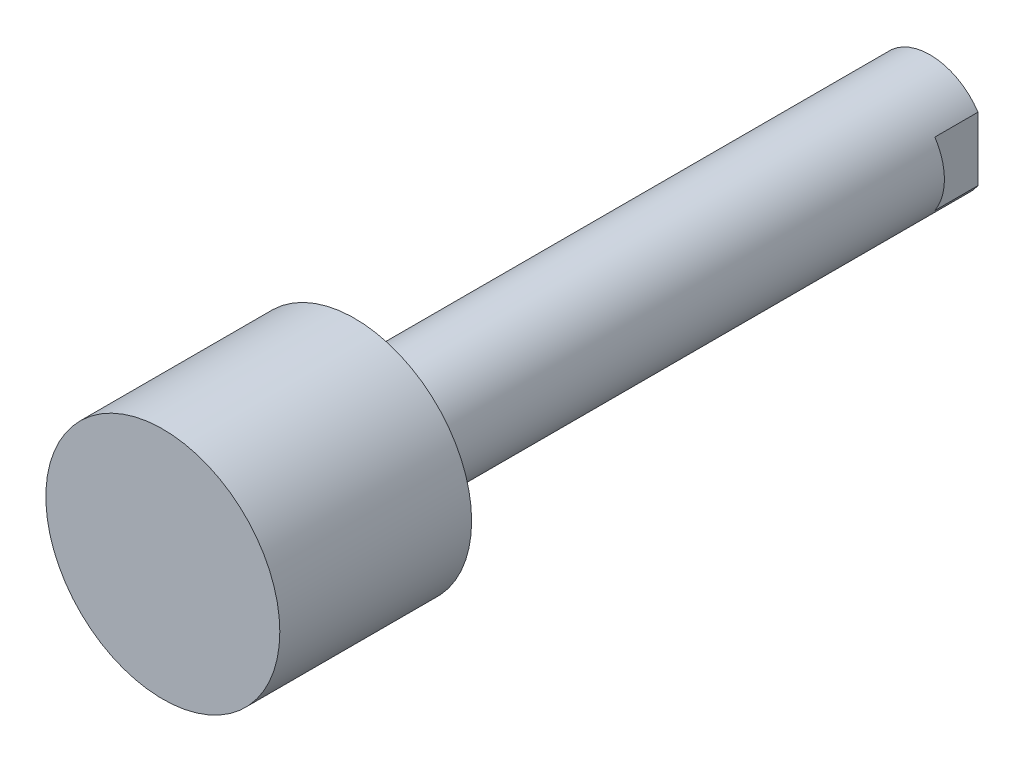
ISO-10303-21;
HEADER;
FILE_DESCRIPTION(('STEP AP214'),'2;1');
FILE_NAME('part.step','',(''),(''),'','','');
FILE_SCHEMA(('AUTOMOTIVE_DESIGN { 1 0 10303 214 1 1 1 1 }'));
ENDSEC;
DATA;
#1=APPLICATION_CONTEXT('core data for automotive mechanical design processes');
#2=APPLICATION_PROTOCOL_DEFINITION('international standard','automotive_design',2000,#1);
#3=PRODUCT_CONTEXT('',#1,'mechanical');
#4=PRODUCT('Part','Part','',(#3));
#5=PRODUCT_RELATED_PRODUCT_CATEGORY('part','',(#4));
#6=PRODUCT_DEFINITION_FORMATION('','',#4);
#7=PRODUCT_DEFINITION_CONTEXT('part definition',#1,'design');
#8=PRODUCT_DEFINITION('design','',#6,#7);
#9=PRODUCT_DEFINITION_SHAPE('','',#8);
#10=(LENGTH_UNIT() NAMED_UNIT(*) SI_UNIT(.MILLI.,.METRE.));
#11=(NAMED_UNIT(*) PLANE_ANGLE_UNIT() SI_UNIT($,.RADIAN.));
#12=(NAMED_UNIT(*) SI_UNIT($,.STERADIAN.) SOLID_ANGLE_UNIT());
#13=UNCERTAINTY_MEASURE_WITH_UNIT(LENGTH_MEASURE(1.E-05),#10,'distance_accuracy_value','');
#14=(GEOMETRIC_REPRESENTATION_CONTEXT(3) GLOBAL_UNCERTAINTY_ASSIGNED_CONTEXT((#13)) GLOBAL_UNIT_ASSIGNED_CONTEXT((#10,
#11,#12)) REPRESENTATION_CONTEXT('',''));
#15=CARTESIAN_POINT('',(0.,0.,0.));
#16=DIRECTION('',(0.,0.,1.));
#17=DIRECTION('',(1.,0.,0.));
#18=AXIS2_PLACEMENT_3D('',#15,#16,#17);
#19=CARTESIAN_POINT('',(0.,0.,30.));
#20=DIRECTION('',(0.,0.,-1.));
#21=DIRECTION('',(-1.,0.,0.));
#22=AXIS2_PLACEMENT_3D('',#19,#20,#21);
#23=CYLINDRICAL_SURFACE('',#22,3.);
#24=CARTESIAN_POINT('',(0.,0.,30.));
#25=DIRECTION('',(0.,0.,1.));
#26=DIRECTION('',(1.,0.,0.));
#27=AXIS2_PLACEMENT_3D('',#24,#25,#26);
#28=CIRCLE('',#27,3.);
#29=CARTESIAN_POINT('',(3.,0.,30.));
#30=VERTEX_POINT('',#29);
#31=EDGE_CURVE('E110',#30,#30,#28,.T.);
#32=ORIENTED_EDGE('',*,*,#31,.F.);
#33=EDGE_LOOP('',(#32));
#34=FACE_BOUND('',#33,.T.);
#35=CARTESIAN_POINT('',(0.,0.,2.25));
#36=DIRECTION('',(0.,0.,1.));
#37=DIRECTION('',(1.,0.,0.));
#38=AXIS2_PLACEMENT_3D('',#35,#36,#37);
#39=CIRCLE('',#38,3.);
#40=CARTESIAN_POINT('',(-2.5,1.6583123951777,2.25));
#41=VERTEX_POINT('',#40);
#42=CARTESIAN_POINT('',(-2.5,-1.6583123951777,2.25));
#43=VERTEX_POINT('',#42);
#44=EDGE_CURVE('E11',#41,#43,#39,.T.);
#45=ORIENTED_EDGE('',*,*,#44,.T.);
#46=DIRECTION('',(0.,0.,-1.));
#47=VECTOR('',#46,1.);
#48=CARTESIAN_POINT('',(-2.49999999999999,-1.65831239517772,30.));
#49=LINE('',#48,#47);
#50=CARTESIAN_POINT('',(-2.5,-1.6583123951777,0.));
#51=VERTEX_POINT('',#50);
#52=EDGE_CURVE('E94',#43,#51,#49,.T.);
#53=ORIENTED_EDGE('',*,*,#52,.T.);
#54=CARTESIAN_POINT('',(0.,0.,0.));
#55=DIRECTION('',(0.,0.,1.));
#56=DIRECTION('',(1.,0.,0.));
#57=AXIS2_PLACEMENT_3D('',#54,#55,#56);
#58=CIRCLE('',#57,3.);
#59=CARTESIAN_POINT('',(2.5,-1.6583123951777,0.));
#60=VERTEX_POINT('',#59);
#61=EDGE_CURVE('E54',#51,#60,#58,.T.);
#62=ORIENTED_EDGE('',*,*,#61,.T.);
#63=DIRECTION('',(0.,0.,-1.));
#64=VECTOR('',#63,1.);
#65=CARTESIAN_POINT('',(2.5,-1.6583123951777,30.));
#66=LINE('',#65,#64);
#67=CARTESIAN_POINT('',(2.5,-1.6583123951777,2.25));
#68=VERTEX_POINT('',#67);
#69=EDGE_CURVE('E99',#60,#68,#66,.F.);
#70=ORIENTED_EDGE('',*,*,#69,.T.);
#71=CARTESIAN_POINT('',(0.,0.,2.25));
#72=DIRECTION('',(0.,0.,1.));
#73=DIRECTION('',(1.,0.,0.));
#74=AXIS2_PLACEMENT_3D('',#71,#72,#73);
#75=CIRCLE('',#74,3.);
#76=CARTESIAN_POINT('',(2.5,1.6583123951777,2.25));
#77=VERTEX_POINT('',#76);
#78=EDGE_CURVE('E119',#68,#77,#75,.T.);
#79=ORIENTED_EDGE('',*,*,#78,.T.);
#80=DIRECTION('',(0.,0.,-1.));
#81=VECTOR('',#80,1.);
#82=CARTESIAN_POINT('',(2.5,1.6583123951777,30.));
#83=LINE('',#82,#81);
#84=CARTESIAN_POINT('',(2.5,1.6583123951777,0.));
#85=VERTEX_POINT('',#84);
#86=EDGE_CURVE('E101',#77,#85,#83,.T.);
#87=ORIENTED_EDGE('',*,*,#86,.T.);
#88=CARTESIAN_POINT('',(-2.5,1.6583123951777,0.));
#89=VERTEX_POINT('',#88);
#90=EDGE_CURVE('E114',#85,#89,#58,.T.);
#91=ORIENTED_EDGE('',*,*,#90,.T.);
#92=DIRECTION('',(0.,0.,-1.));
#93=VECTOR('',#92,1.);
#94=CARTESIAN_POINT('',(-2.49999999999999,1.65831239517772,30.));
#95=LINE('',#94,#93);
#96=EDGE_CURVE('E46',#89,#41,#95,.F.);
#97=ORIENTED_EDGE('',*,*,#96,.T.);
#98=EDGE_LOOP('',(#45,#53,#62,#70,#79,#87,#91,#97));
#99=FACE_BOUND('',#98,.T.);
#100=ADVANCED_FACE('F32',(#34,#99),#23,.T.);
#101=CARTESIAN_POINT('',(0.,0.,0.));
#102=DIRECTION('',(0.,0.,1.));
#103=DIRECTION('',(1.,0.,0.));
#104=AXIS2_PLACEMENT_3D('',#101,#102,#103);
#105=PLANE('',#104);
#106=CARTESIAN_POINT('',(0.,0.,0.));
#107=DIRECTION('',(0.,0.,-1.));
#108=DIRECTION('',(-1.,0.,0.));
#109=AXIS2_PLACEMENT_3D('',#106,#107,#108);
#110=CIRCLE('',#109,1.25);
#111=CARTESIAN_POINT('',(-1.25,0.,0.));
#112=VERTEX_POINT('',#111);
#113=EDGE_CURVE('E87',#112,#112,#110,.T.);
#114=ORIENTED_EDGE('',*,*,#113,.F.);
#115=EDGE_LOOP('',(#114));
#116=FACE_BOUND('',#115,.T.);
#117=ORIENTED_EDGE('',*,*,#61,.F.);
#118=DIRECTION('',(0.,1.,0.));
#119=VECTOR('',#118,1.);
#120=CARTESIAN_POINT('',(-2.5,0.,0.));
#121=LINE('',#120,#119);
#122=EDGE_CURVE('E39',#51,#89,#121,.T.);
#123=ORIENTED_EDGE('',*,*,#122,.T.);
#124=ORIENTED_EDGE('',*,*,#90,.F.);
#125=DIRECTION('',(0.,-1.,0.));
#126=VECTOR('',#125,1.);
#127=CARTESIAN_POINT('',(2.5,0.,0.));
#128=LINE('',#127,#126);
#129=EDGE_CURVE('E113',#85,#60,#128,.T.);
#130=ORIENTED_EDGE('',*,*,#129,.T.);
#131=EDGE_LOOP('',(#117,#123,#124,#130));
#132=FACE_BOUND('',#131,.T.);
#133=ADVANCED_FACE('F123',(#116,#132),#105,.F.);
#134=CARTESIAN_POINT('',(0.,0.,30.));
#135=DIRECTION('',(0.,0.,1.));
#136=DIRECTION('',(1.,0.,0.));
#137=AXIS2_PLACEMENT_3D('',#134,#135,#136);
#138=PLANE('',#137);
#139=CARTESIAN_POINT('',(0.,0.,30.));
#140=DIRECTION('',(0.,0.,1.));
#141=DIRECTION('',(1.,0.,0.));
#142=AXIS2_PLACEMENT_3D('',#139,#140,#141);
#143=CIRCLE('',#142,6.09956763465453);
#144=CARTESIAN_POINT('',(6.09956763465453,0.,30.));
#145=VERTEX_POINT('',#144);
#146=EDGE_CURVE('E104',#145,#145,#143,.T.);
#147=ORIENTED_EDGE('',*,*,#146,.F.);
#148=EDGE_LOOP('',(#147));
#149=FACE_BOUND('',#148,.T.);
#150=ORIENTED_EDGE('',*,*,#31,.T.);
#151=EDGE_LOOP('',(#150));
#152=FACE_BOUND('',#151,.T.);
#153=ADVANCED_FACE('F147',(#149,#152),#138,.F.);
#154=CARTESIAN_POINT('',(0.,0.,40.));
#155=DIRECTION('',(0.,0.,-1.));
#156=DIRECTION('',(-1.,0.,0.));
#157=AXIS2_PLACEMENT_3D('',#154,#155,#156);
#158=CYLINDRICAL_SURFACE('',#157,6.09956763465453);
#159=CARTESIAN_POINT('',(0.,0.,40.));
#160=DIRECTION('',(0.,0.,1.));
#161=DIRECTION('',(1.,0.,0.));
#162=AXIS2_PLACEMENT_3D('',#159,#160,#161);
#163=CIRCLE('',#162,6.09956763465453);
#164=CARTESIAN_POINT('',(6.09956763465453,0.,40.));
#165=VERTEX_POINT('',#164);
#166=EDGE_CURVE('E105',#165,#165,#163,.T.);
#167=ORIENTED_EDGE('',*,*,#166,.F.);
#168=EDGE_LOOP('',(#167));
#169=FACE_BOUND('',#168,.T.);
#170=ORIENTED_EDGE('',*,*,#146,.T.);
#171=EDGE_LOOP('',(#170));
#172=FACE_BOUND('',#171,.T.);
#173=ADVANCED_FACE('F138',(#169,#172),#158,.T.);
#174=CARTESIAN_POINT('',(0.,0.,40.));
#175=DIRECTION('',(0.,0.,1.));
#176=DIRECTION('',(1.,0.,0.));
#177=AXIS2_PLACEMENT_3D('',#174,#175,#176);
#178=PLANE('',#177);
#179=ORIENTED_EDGE('',*,*,#166,.T.);
#180=EDGE_LOOP('',(#179));
#181=FACE_BOUND('',#180,.T.);
#182=ADVANCED_FACE('F130',(#181),#178,.T.);
#183=CARTESIAN_POINT('',(4.93383408984432,-6.09956763465453,2.25));
#184=DIRECTION('',(0.,0.,1.));
#185=DIRECTION('',(1.,0.,0.));
#186=AXIS2_PLACEMENT_3D('',#183,#184,#185);
#187=PLANE('',#186);
#188=DIRECTION('',(0.,1.,0.));
#189=VECTOR('',#188,1.);
#190=CARTESIAN_POINT('',(2.5,-6.09956763465453,2.25));
#191=LINE('',#190,#189);
#192=EDGE_CURVE('E96',#68,#77,#191,.T.);
#193=ORIENTED_EDGE('',*,*,#192,.T.);
#194=ORIENTED_EDGE('',*,*,#78,.F.);
#195=EDGE_LOOP('',(#193,#194));
#196=FACE_BOUND('',#195,.T.);
#197=ADVANCED_FACE('F128',(#196),#187,.F.);
#198=CARTESIAN_POINT('',(2.5,-6.09956763465453,2.25));
#199=DIRECTION('',(-1.,0.,0.));
#200=DIRECTION('',(0.,0.,1.));
#201=AXIS2_PLACEMENT_3D('',#198,#199,#200);
#202=PLANE('',#201);
#203=ORIENTED_EDGE('',*,*,#192,.F.);
#204=ORIENTED_EDGE('',*,*,#69,.F.);
#205=ORIENTED_EDGE('',*,*,#129,.F.);
#206=ORIENTED_EDGE('',*,*,#86,.F.);
#207=EDGE_LOOP('',(#203,#204,#205,#206));
#208=FACE_BOUND('',#207,.T.);
#209=ADVANCED_FACE('F126',(#208),#202,.F.);
#210=CARTESIAN_POINT('',(-5.20418116326044,-6.09956763465453,2.25));
#211=DIRECTION('',(0.,0.,1.));
#212=DIRECTION('',(1.,0.,0.));
#213=AXIS2_PLACEMENT_3D('',#210,#211,#212);
#214=PLANE('',#213);
#215=DIRECTION('',(0.,1.,0.));
#216=VECTOR('',#215,1.);
#217=CARTESIAN_POINT('',(-2.5,-6.09956763465453,2.25));
#218=LINE('',#217,#216);
#219=EDGE_CURVE('E86',#43,#41,#218,.T.);
#220=ORIENTED_EDGE('',*,*,#219,.F.);
#221=ORIENTED_EDGE('',*,*,#44,.F.);
#222=EDGE_LOOP('',(#220,#221));
#223=FACE_BOUND('',#222,.T.);
#224=ADVANCED_FACE('F136',(#223),#214,.F.);
#225=CARTESIAN_POINT('',(-2.5,-6.09956763465453,2.25));
#226=DIRECTION('',(1.,0.,0.));
#227=DIRECTION('',(0.,0.,-1.));
#228=AXIS2_PLACEMENT_3D('',#225,#226,#227);
#229=PLANE('',#228);
#230=ORIENTED_EDGE('',*,*,#219,.T.);
#231=ORIENTED_EDGE('',*,*,#96,.F.);
#232=ORIENTED_EDGE('',*,*,#122,.F.);
#233=ORIENTED_EDGE('',*,*,#52,.F.);
#234=EDGE_LOOP('',(#230,#231,#232,#233));
#235=FACE_BOUND('',#234,.T.);
#236=ADVANCED_FACE('F80',(#235),#229,.F.);
#237=CARTESIAN_POINT('',(0.,0.,2.999994));
#238=DIRECTION('',(0.,0.,-1.));
#239=DIRECTION('',(-1.,0.,0.));
#240=AXIS2_PLACEMENT_3D('',#237,#238,#239);
#241=CONICAL_SURFACE('',#240,1.25,1.02974425867665);
#242=CARTESIAN_POINT('',(0.,0.,3.75106977378445));
#243=VERTEX_POINT('',#242);
#244=VERTEX_LOOP('',#243);
#245=FACE_BOUND('',#244,.T.);
#246=CARTESIAN_POINT('',(0.,0.,2.999994));
#247=DIRECTION('',(0.,0.,-1.));
#248=DIRECTION('',(-1.,0.,0.));
#249=AXIS2_PLACEMENT_3D('',#246,#247,#248);
#250=CIRCLE('',#249,1.25);
#251=CARTESIAN_POINT('',(-1.25,0.,2.999994));
#252=VERTEX_POINT('',#251);
#253=EDGE_CURVE('E84',#252,#252,#250,.T.);
#254=ORIENTED_EDGE('',*,*,#253,.T.);
#255=EDGE_LOOP('',(#254));
#256=FACE_BOUND('',#255,.T.);
#257=ADVANCED_FACE('F76',(#245,#256),#241,.F.);
#258=CARTESIAN_POINT('',(0.,0.,0.));
#259=DIRECTION('',(0.,0.,-1.));
#260=DIRECTION('',(-1.,0.,0.));
#261=AXIS2_PLACEMENT_3D('',#258,#259,#260);
#262=CYLINDRICAL_SURFACE('',#261,1.25);
#263=ORIENTED_EDGE('',*,*,#253,.F.);
#264=EDGE_LOOP('',(#263));
#265=FACE_BOUND('',#264,.T.);
#266=ORIENTED_EDGE('',*,*,#113,.T.);
#267=EDGE_LOOP('',(#266));
#268=FACE_BOUND('',#267,.T.);
#269=ADVANCED_FACE('F79',(#265,#268),#262,.F.);
#270=CLOSED_SHELL('',(#100,#133,#153,#173,#182,#197,#209,#224,#236,#257,#269));
#271=MANIFOLD_SOLID_BREP('B2',#270);
#272=ADVANCED_BREP_SHAPE_REPRESENTATION('',(#18,#271),#14);
#273=SHAPE_DEFINITION_REPRESENTATION(#9,#272);
ENDSEC;
END-ISO-10303-21;
